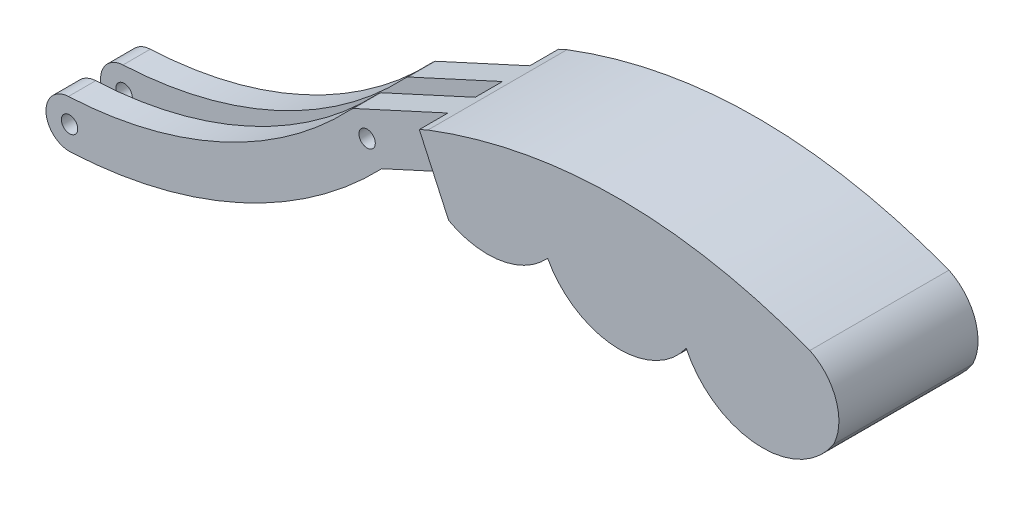
ISO-10303-21;
HEADER;
FILE_DESCRIPTION(('STEP AP214'),'2;1');
FILE_NAME('part.step','',(''),(''),'','','');
FILE_SCHEMA(('AUTOMOTIVE_DESIGN { 1 0 10303 214 1 1 1 1 }'));
ENDSEC;
DATA;
#1=APPLICATION_CONTEXT('core data for automotive mechanical design processes');
#2=APPLICATION_PROTOCOL_DEFINITION('international standard','automotive_design',2000,#1);
#3=PRODUCT_CONTEXT('',#1,'mechanical');
#4=PRODUCT('Part','Part','',(#3));
#5=PRODUCT_RELATED_PRODUCT_CATEGORY('part','',(#4));
#6=PRODUCT_DEFINITION_FORMATION('','',#4);
#7=PRODUCT_DEFINITION_CONTEXT('part definition',#1,'design');
#8=PRODUCT_DEFINITION('design','',#6,#7);
#9=PRODUCT_DEFINITION_SHAPE('','',#8);
#10=(LENGTH_UNIT() NAMED_UNIT(*) SI_UNIT(.MILLI.,.METRE.));
#11=(NAMED_UNIT(*) PLANE_ANGLE_UNIT() SI_UNIT($,.RADIAN.));
#12=(NAMED_UNIT(*) SI_UNIT($,.STERADIAN.) SOLID_ANGLE_UNIT());
#13=UNCERTAINTY_MEASURE_WITH_UNIT(LENGTH_MEASURE(1.E-05),#10,'distance_accuracy_value','');
#14=(GEOMETRIC_REPRESENTATION_CONTEXT(3) GLOBAL_UNCERTAINTY_ASSIGNED_CONTEXT((#13)) GLOBAL_UNIT_ASSIGNED_CONTEXT((#10,
#11,#12)) REPRESENTATION_CONTEXT('',''));
#15=CARTESIAN_POINT('',(0.,0.,0.));
#16=DIRECTION('',(0.,0.,1.));
#17=DIRECTION('',(1.,0.,0.));
#18=AXIS2_PLACEMENT_3D('',#15,#16,#17);
#19=CARTESIAN_POINT('',(-7.51488259564981,160.395538162248,51.));
#20=DIRECTION('',(0.,0.,-1.));
#21=DIRECTION('',(-1.00000000000001,0.,0.));
#22=AXIS2_PLACEMENT_3D('',#19,#20,#21);
#23=CYLINDRICAL_SURFACE('',#22,151.929423701967);
#24=CARTESIAN_POINT('',(-7.51488259564981,160.395538162248,30.5));
#25=DIRECTION('',(0.,0.,1.));
#26=DIRECTION('',(1.00000000000001,0.,0.));
#27=AXIS2_PLACEMENT_3D('',#24,#25,#26);
#28=CIRCLE('',#27,151.929423701967);
#29=CARTESIAN_POINT('',(-0.404455892615174,8.63259268966887,30.5));
#30=VERTEX_POINT('',#29);
#31=CARTESIAN_POINT('',(102.811525100252,55.9415600123962,30.5));
#32=VERTEX_POINT('',#31);
#33=EDGE_CURVE('E337',#30,#32,#28,.T.);
#34=ORIENTED_EDGE('',*,*,#33,.F.);
#35=DIRECTION('',(0.,0.,-1.));
#36=VECTOR('',#35,1.);
#37=CARTESIAN_POINT('',(-0.404455892615174,8.63259268966887,51.));
#38=LINE('',#37,#36);
#39=CARTESIAN_POINT('',(-0.404455892615174,8.63259268966887,40.5));
#40=VERTEX_POINT('',#39);
#41=EDGE_CURVE('E340',#40,#30,#38,.T.);
#42=ORIENTED_EDGE('',*,*,#41,.F.);
#43=CARTESIAN_POINT('',(-7.51488259564981,160.395538162248,40.5));
#44=DIRECTION('',(0.,0.,-1.));
#45=DIRECTION('',(-1.00000000000001,0.,0.));
#46=AXIS2_PLACEMENT_3D('',#43,#44,#45);
#47=CIRCLE('',#46,151.929423701967);
#48=CARTESIAN_POINT('',(102.811525100252,55.9415600123962,40.5));
#49=VERTEX_POINT('',#48);
#50=EDGE_CURVE('E249',#49,#40,#47,.T.);
#51=ORIENTED_EDGE('',*,*,#50,.F.);
#52=DIRECTION('',(0.,0.,-1.));
#53=VECTOR('',#52,1.);
#54=CARTESIAN_POINT('',(102.811525100252,55.9415600123962,51.));
#55=LINE('',#54,#53);
#56=EDGE_CURVE('E342',#49,#32,#55,.T.);
#57=ORIENTED_EDGE('',*,*,#56,.T.);
#58=EDGE_LOOP('',(#34,#42,#51,#57));
#59=FACE_BOUND('',#58,.T.);
#60=ADVANCED_FACE('F47',(#59),#23,.F.);
#61=CARTESIAN_POINT('',(0.,0.,51.));
#62=DIRECTION('',(0.,0.,-1.));
#63=DIRECTION('',(-1.00000000000001,0.,0.));
#64=AXIS2_PLACEMENT_3D('',#61,#62,#63);
#65=CYLINDRICAL_SURFACE('',#64,8.64206231838189);
#66=ORIENTED_EDGE('',*,*,#41,.T.);
#67=CARTESIAN_POINT('',(0.,0.,30.5));
#68=DIRECTION('',(0.,0.,1.));
#69=DIRECTION('',(1.00000000000001,0.,0.));
#70=AXIS2_PLACEMENT_3D('',#67,#68,#69);
#71=CIRCLE('',#70,8.64206231838189);
#72=CARTESIAN_POINT('',(0.404455892615396,-8.63259268966887,30.5));
#73=VERTEX_POINT('',#72);
#74=EDGE_CURVE('E345',#30,#73,#71,.T.);
#75=ORIENTED_EDGE('',*,*,#74,.T.);
#76=DIRECTION('',(0.,0.,-1.));
#77=VECTOR('',#76,1.);
#78=CARTESIAN_POINT('',(0.404455892615396,-8.63259268966887,51.));
#79=LINE('',#78,#77);
#80=CARTESIAN_POINT('',(0.404455892615396,-8.63259268966887,40.5));
#81=VERTEX_POINT('',#80);
#82=EDGE_CURVE('E355',#81,#73,#79,.T.);
#83=ORIENTED_EDGE('',*,*,#82,.F.);
#84=CARTESIAN_POINT('',(0.,0.,40.5));
#85=DIRECTION('',(0.,0.,-1.));
#86=DIRECTION('',(-1.00000000000001,0.,0.));
#87=AXIS2_PLACEMENT_3D('',#84,#85,#86);
#88=CIRCLE('',#87,8.64206231838189);
#89=EDGE_CURVE('E251',#81,#40,#88,.T.);
#90=ORIENTED_EDGE('',*,*,#89,.T.);
#91=EDGE_LOOP('',(#66,#75,#83,#90));
#92=FACE_BOUND('',#91,.T.);
#93=ADVANCED_FACE('F321',(#92),#65,.T.);
#94=CARTESIAN_POINT('',(-7.51488259564981,160.395538162248,51.));
#95=DIRECTION('',(0.,0.,-1.));
#96=DIRECTION('',(-1.00000000000001,0.,0.));
#97=AXIS2_PLACEMENT_3D('',#94,#95,#96);
#98=CYLINDRICAL_SURFACE('',#97,169.213548338731);
#99=ORIENTED_EDGE('',*,*,#82,.T.);
#100=CARTESIAN_POINT('',(-7.51488259564981,160.395538162248,30.5));
#101=DIRECTION('',(0.,0.,1.));
#102=DIRECTION('',(1.00000000000001,0.,0.));
#103=AXIS2_PLACEMENT_3D('',#100,#101,#102);
#104=CIRCLE('',#103,169.213548338731);
#105=CARTESIAN_POINT('',(114.459542910341,43.1118459289813,30.5));
#106=VERTEX_POINT('',#105);
#107=EDGE_CURVE('E478',#73,#106,#104,.T.);
#108=ORIENTED_EDGE('',*,*,#107,.T.);
#109=DIRECTION('',(0.,0.,-1.));
#110=VECTOR('',#109,1.);
#111=CARTESIAN_POINT('',(114.459542910341,43.1118459289813,51.));
#112=LINE('',#111,#110);
#113=CARTESIAN_POINT('',(114.459542910341,43.1118459289813,40.5));
#114=VERTEX_POINT('',#113);
#115=EDGE_CURVE('E402',#114,#106,#112,.T.);
#116=ORIENTED_EDGE('',*,*,#115,.F.);
#117=CARTESIAN_POINT('',(-7.51488259564981,160.395538162248,40.5));
#118=DIRECTION('',(0.,0.,-1.));
#119=DIRECTION('',(-1.00000000000001,0.,0.));
#120=AXIS2_PLACEMENT_3D('',#117,#118,#119);
#121=CIRCLE('',#120,169.213548338731);
#122=EDGE_CURVE('E254',#114,#81,#121,.T.);
#123=ORIENTED_EDGE('',*,*,#122,.T.);
#124=EDGE_LOOP('',(#99,#108,#116,#123));
#125=FACE_BOUND('',#124,.T.);
#126=ADVANCED_FACE('F318',(#125),#98,.T.);
#127=CARTESIAN_POINT('',(3.54177078409457,-7.72723157194288,51.));
#128=DIRECTION('',(-0.416666666666668,0.909059342886315,0.));
#129=DIRECTION('',(-0.909059342886315,-0.416666666666668,0.));
#130=AXIS2_PLACEMENT_3D('',#127,#128,#129);
#131=PLANE('',#130);
#132=ORIENTED_EDGE('',*,*,#115,.T.);
#133=DIRECTION('',(0.909059342886315,0.416666666666668,0.));
#134=VECTOR('',#133,1.);
#135=CARTESIAN_POINT('',(3.54177078409457,-7.72723157194288,30.5));
#136=LINE('',#135,#134);
#137=CARTESIAN_POINT('',(141.660745716674,55.579496793943,30.5));
#138=VERTEX_POINT('',#137);
#139=EDGE_CURVE('E383',#106,#138,#136,.T.);
#140=ORIENTED_EDGE('',*,*,#139,.T.);
#141=DIRECTION('',(0.,0.,-1.));
#142=VECTOR('',#141,1.);
#143=CARTESIAN_POINT('',(141.660745716674,55.579496793943,51.));
#144=LINE('',#143,#142);
#145=CARTESIAN_POINT('',(141.660745716674,55.579496793943,40.5));
#146=VERTEX_POINT('',#145);
#147=EDGE_CURVE('E403',#146,#138,#144,.T.);
#148=ORIENTED_EDGE('',*,*,#147,.F.);
#149=DIRECTION('',(-0.909059342886315,-0.416666666666668,0.));
#150=VECTOR('',#149,1.);
#151=CARTESIAN_POINT('',(3.54177078409457,-7.72723157194288,40.5));
#152=LINE('',#151,#150);
#153=EDGE_CURVE('E257',#146,#114,#152,.T.);
#154=ORIENTED_EDGE('',*,*,#153,.T.);
#155=EDGE_LOOP('',(#132,#140,#148,#154));
#156=FACE_BOUND('',#155,.T.);
#157=ADVANCED_FACE('F314',(#156),#131,.F.);
#158=CARTESIAN_POINT('',(0.,0.,51.));
#159=DIRECTION('',(0.,0.,-1.));
#160=DIRECTION('',(-1.00000000000001,0.,0.));
#161=AXIS2_PLACEMENT_3D('',#158,#159,#160);
#162=CYLINDRICAL_SURFACE('',#161,3.00000000000001);
#163=CARTESIAN_POINT('',(0.,0.,30.5));
#164=DIRECTION('',(0.,0.,1.));
#165=DIRECTION('',(1.00000000000001,0.,0.));
#166=AXIS2_PLACEMENT_3D('',#163,#164,#165);
#167=CIRCLE('',#166,3.00000000000001);
#168=CARTESIAN_POINT('',(3.00000000000002,0.,30.5));
#169=VERTEX_POINT('',#168);
#170=EDGE_CURVE('E372',#169,#169,#167,.T.);
#171=ORIENTED_EDGE('',*,*,#170,.F.);
#172=EDGE_LOOP('',(#171));
#173=FACE_BOUND('',#172,.T.);
#174=CARTESIAN_POINT('',(0.,0.,40.5));
#175=DIRECTION('',(0.,0.,-1.));
#176=DIRECTION('',(-1.00000000000001,0.,0.));
#177=AXIS2_PLACEMENT_3D('',#174,#175,#176);
#178=CIRCLE('',#177,3.00000000000001);
#179=CARTESIAN_POINT('',(-3.00000000000002,0.,40.5));
#180=VERTEX_POINT('',#179);
#181=EDGE_CURVE('E263',#180,#180,#178,.T.);
#182=ORIENTED_EDGE('',*,*,#181,.F.);
#183=EDGE_LOOP('',(#182));
#184=FACE_BOUND('',#183,.T.);
#185=ADVANCED_FACE('F516',(#173,#184),#162,.F.);
#186=CARTESIAN_POINT('',(109.087121146358,50.000000000001,51.));
#187=DIRECTION('',(0.,0.,-1.));
#188=DIRECTION('',(-1.00000000000001,0.,0.));
#189=AXIS2_PLACEMENT_3D('',#186,#187,#188);
#190=CYLINDRICAL_SURFACE('',#189,8.64206231838191);
#191=DIRECTION('',(0.,0.,-1.));
#192=VECTOR('',#191,1.);
#193=CARTESIAN_POINT('',(104.127977562039,57.0775798140967,51.));
#194=LINE('',#193,#192);
#195=CARTESIAN_POINT('',(104.127977562039,57.0775798140967,40.5));
#196=VERTEX_POINT('',#195);
#197=CARTESIAN_POINT('',(104.127977562039,57.0775798140967,30.5));
#198=VERTEX_POINT('',#197);
#199=EDGE_CURVE('E422',#196,#198,#194,.T.);
#200=ORIENTED_EDGE('',*,*,#199,.T.);
#201=CARTESIAN_POINT('',(109.087121146358,50.000000000001,30.5));
#202=DIRECTION('',(0.,0.,1.));
#203=DIRECTION('',(1.00000000000001,0.,0.));
#204=AXIS2_PLACEMENT_3D('',#201,#202,#203);
#205=CIRCLE('',#204,8.64206231838191);
#206=EDGE_CURVE('E367',#198,#32,#205,.T.);
#207=ORIENTED_EDGE('',*,*,#206,.T.);
#208=ORIENTED_EDGE('',*,*,#56,.F.);
#209=CARTESIAN_POINT('',(109.087121146358,50.000000000001,40.5));
#210=DIRECTION('',(0.,0.,-1.));
#211=DIRECTION('',(-1.00000000000001,0.,0.));
#212=AXIS2_PLACEMENT_3D('',#209,#210,#211);
#213=CIRCLE('',#212,8.64206231838191);
#214=EDGE_CURVE('E244',#49,#196,#213,.T.);
#215=ORIENTED_EDGE('',*,*,#214,.T.);
#216=EDGE_LOOP('',(#200,#207,#208,#215));
#217=FACE_BOUND('',#216,.T.);
#218=ADVANCED_FACE('F474',(#217),#190,.T.);
#219=CARTESIAN_POINT('',(109.087121146358,50.0000000000012,51.));
#220=DIRECTION('',(0.,0.,-1.));
#221=DIRECTION('',(-1.00000000000001,0.,0.));
#222=AXIS2_PLACEMENT_3D('',#219,#220,#221);
#223=CYLINDRICAL_SURFACE('',#222,3.00000000000001);
#224=CARTESIAN_POINT('',(109.087121146358,50.0000000000012,30.5));
#225=DIRECTION('',(0.,0.,1.));
#226=DIRECTION('',(1.00000000000001,0.,0.));
#227=AXIS2_PLACEMENT_3D('',#224,#225,#226);
#228=CIRCLE('',#227,3.00000000000001);
#229=CARTESIAN_POINT('',(112.087121146358,50.0000000000012,30.5));
#230=VERTEX_POINT('',#229);
#231=EDGE_CURVE('E365',#230,#230,#228,.T.);
#232=ORIENTED_EDGE('',*,*,#231,.F.);
#233=EDGE_LOOP('',(#232));
#234=FACE_BOUND('',#233,.T.);
#235=CARTESIAN_POINT('',(109.087121146358,50.0000000000012,40.5));
#236=DIRECTION('',(0.,0.,-1.));
#237=DIRECTION('',(-1.00000000000001,0.,0.));
#238=AXIS2_PLACEMENT_3D('',#235,#236,#237);
#239=CIRCLE('',#238,3.00000000000001);
#240=CARTESIAN_POINT('',(106.087121146358,50.0000000000012,40.5));
#241=VERTEX_POINT('',#240);
#242=EDGE_CURVE('E243',#241,#241,#239,.T.);
#243=ORIENTED_EDGE('',*,*,#242,.F.);
#244=EDGE_LOOP('',(#243));
#245=FACE_BOUND('',#244,.T.);
#246=ADVANCED_FACE('F325',(#234,#245),#223,.F.);
#247=CARTESIAN_POINT('',(-7.51488259564981,160.395538162248,10.5));
#248=DIRECTION('',(0.,0.,1.));
#249=DIRECTION('',(1.00000000000001,0.,0.));
#250=AXIS2_PLACEMENT_3D('',#247,#248,#249);
#251=CIRCLE('',#250,151.929423701967);
#252=CARTESIAN_POINT('',(-0.404455892615174,8.63259268966887,10.5));
#253=VERTEX_POINT('',#252);
#254=CARTESIAN_POINT('',(102.811525100252,55.9415600123962,10.5));
#255=VERTEX_POINT('',#254);
#256=EDGE_CURVE('E388',#253,#255,#251,.T.);
#257=ORIENTED_EDGE('',*,*,#256,.F.);
#258=CARTESIAN_POINT('',(-0.404455892615174,8.63259268966887,20.5));
#259=VERTEX_POINT('',#258);
#260=EDGE_CURVE('E352',#259,#253,#38,.T.);
#261=ORIENTED_EDGE('',*,*,#260,.F.);
#262=CARTESIAN_POINT('',(-7.51488259564981,160.395538162248,20.5));
#263=DIRECTION('',(0.,0.,-1.));
#264=DIRECTION('',(-1.00000000000001,0.,0.));
#265=AXIS2_PLACEMENT_3D('',#262,#263,#264);
#266=CIRCLE('',#265,151.929423701967);
#267=CARTESIAN_POINT('',(102.811525100252,55.9415600123962,20.5));
#268=VERTEX_POINT('',#267);
#269=EDGE_CURVE('E492',#268,#259,#266,.T.);
#270=ORIENTED_EDGE('',*,*,#269,.F.);
#271=EDGE_CURVE('E427',#268,#255,#55,.T.);
#272=ORIENTED_EDGE('',*,*,#271,.T.);
#273=EDGE_LOOP('',(#257,#261,#270,#272));
#274=FACE_BOUND('',#273,.T.);
#275=ADVANCED_FACE('F49',(#274),#23,.F.);
#276=ORIENTED_EDGE('',*,*,#260,.T.);
#277=CARTESIAN_POINT('',(0.,0.,10.5));
#278=DIRECTION('',(0.,0.,1.));
#279=DIRECTION('',(1.00000000000001,0.,0.));
#280=AXIS2_PLACEMENT_3D('',#277,#278,#279);
#281=CIRCLE('',#280,8.64206231838189);
#282=CARTESIAN_POINT('',(0.404455892615396,-8.63259268966887,10.5));
#283=VERTEX_POINT('',#282);
#284=EDGE_CURVE('E390',#253,#283,#281,.T.);
#285=ORIENTED_EDGE('',*,*,#284,.T.);
#286=CARTESIAN_POINT('',(0.404455892615396,-8.63259268966887,20.5));
#287=VERTEX_POINT('',#286);
#288=EDGE_CURVE('E399',#287,#283,#79,.T.);
#289=ORIENTED_EDGE('',*,*,#288,.F.);
#290=CARTESIAN_POINT('',(0.,0.,20.5));
#291=DIRECTION('',(0.,0.,-1.));
#292=DIRECTION('',(-1.00000000000001,0.,0.));
#293=AXIS2_PLACEMENT_3D('',#290,#291,#292);
#294=CIRCLE('',#293,8.64206231838189);
#295=EDGE_CURVE('E494',#287,#259,#294,.T.);
#296=ORIENTED_EDGE('',*,*,#295,.T.);
#297=EDGE_LOOP('',(#276,#285,#289,#296));
#298=FACE_BOUND('',#297,.T.);
#299=ADVANCED_FACE('F316',(#298),#65,.T.);
#300=ORIENTED_EDGE('',*,*,#288,.T.);
#301=CARTESIAN_POINT('',(-7.51488259564981,160.395538162248,10.5));
#302=DIRECTION('',(0.,0.,1.));
#303=DIRECTION('',(1.00000000000001,0.,0.));
#304=AXIS2_PLACEMENT_3D('',#301,#302,#303);
#305=CIRCLE('',#304,169.213548338731);
#306=CARTESIAN_POINT('',(114.459542910341,43.1118459289813,10.5));
#307=VERTEX_POINT('',#306);
#308=EDGE_CURVE('E229',#283,#307,#305,.T.);
#309=ORIENTED_EDGE('',*,*,#308,.T.);
#310=CARTESIAN_POINT('',(114.459542910341,43.1118459289813,20.5));
#311=VERTEX_POINT('',#310);
#312=EDGE_CURVE('E397',#311,#307,#112,.T.);
#313=ORIENTED_EDGE('',*,*,#312,.F.);
#314=CARTESIAN_POINT('',(-7.51488259564981,160.395538162248,20.5));
#315=DIRECTION('',(0.,0.,-1.));
#316=DIRECTION('',(-1.00000000000001,0.,0.));
#317=AXIS2_PLACEMENT_3D('',#314,#315,#316);
#318=CIRCLE('',#317,169.213548338731);
#319=EDGE_CURVE('E497',#311,#287,#318,.T.);
#320=ORIENTED_EDGE('',*,*,#319,.T.);
#321=EDGE_LOOP('',(#300,#309,#313,#320));
#322=FACE_BOUND('',#321,.T.);
#323=ADVANCED_FACE('F312',(#322),#98,.T.);
#324=ORIENTED_EDGE('',*,*,#312,.T.);
#325=DIRECTION('',(0.909059342886315,0.416666666666668,0.));
#326=VECTOR('',#325,1.);
#327=CARTESIAN_POINT('',(3.54177078409457,-7.72723157194288,10.5));
#328=LINE('',#327,#326);
#329=CARTESIAN_POINT('',(141.660745716674,55.579496793943,10.5));
#330=VERTEX_POINT('',#329);
#331=EDGE_CURVE('E224',#307,#330,#328,.T.);
#332=ORIENTED_EDGE('',*,*,#331,.T.);
#333=CARTESIAN_POINT('',(141.660745716674,55.579496793943,20.5));
#334=VERTEX_POINT('',#333);
#335=EDGE_CURVE('E222',#334,#330,#144,.T.);
#336=ORIENTED_EDGE('',*,*,#335,.F.);
#337=DIRECTION('',(-0.909059342886315,-0.416666666666668,0.));
#338=VECTOR('',#337,1.);
#339=CARTESIAN_POINT('',(3.54177078409457,-7.72723157194288,20.5));
#340=LINE('',#339,#338);
#341=EDGE_CURVE('E401',#334,#311,#340,.T.);
#342=ORIENTED_EDGE('',*,*,#341,.T.);
#343=EDGE_LOOP('',(#324,#332,#336,#342));
#344=FACE_BOUND('',#343,.T.);
#345=ADVANCED_FACE('F309',(#344),#131,.F.);
#346=CARTESIAN_POINT('',(163.715018222086,75.6745486769844,51.));
#347=DIRECTION('',(0.,0.,-1.));
#348=DIRECTION('',(-1.00000000000001,0.,0.));
#349=AXIS2_PLACEMENT_3D('',#346,#347,#348);
#350=CYLINDRICAL_SURFACE('',#349,29.8362538855851);
#351=CARTESIAN_POINT('',(163.715018222086,75.6745486769844,10.5));
#352=DIRECTION('',(0.,0.,1.));
#353=DIRECTION('',(1.00000000000001,0.,0.));
#354=AXIS2_PLACEMENT_3D('',#351,#352,#353);
#355=CIRCLE('',#354,29.8362538855851);
#356=CARTESIAN_POINT('',(149.4918839759,49.4466151300944,10.5));
#357=VERTEX_POINT('',#356);
#358=EDGE_CURVE('E212',#330,#357,#355,.T.);
#359=ORIENTED_EDGE('',*,*,#358,.T.);
#360=DIRECTION('',(0.,0.,-1.));
#361=VECTOR('',#360,1.);
#362=CARTESIAN_POINT('',(149.4918839759,49.4466151300944,51.));
#363=LINE('',#362,#361);
#364=CARTESIAN_POINT('',(149.4918839759,49.4466151300944,0.));
#365=VERTEX_POINT('',#364);
#366=EDGE_CURVE('E201',#357,#365,#363,.T.);
#367=ORIENTED_EDGE('',*,*,#366,.T.);
#368=CARTESIAN_POINT('',(163.715018222086,75.6745486769844,0.));
#369=DIRECTION('',(0.,0.,1.));
#370=DIRECTION('',(1.00000000000001,0.,0.));
#371=AXIS2_PLACEMENT_3D('',#368,#369,#370);
#372=CIRCLE('',#371,29.8362538855851);
#373=CARTESIAN_POINT('',(185.769290727498,55.5794967939431,0.));
#374=VERTEX_POINT('',#373);
#375=EDGE_CURVE('E266',#365,#374,#372,.T.);
#376=ORIENTED_EDGE('',*,*,#375,.T.);
#377=DIRECTION('',(0.,0.,-1.));
#378=VECTOR('',#377,1.);
#379=CARTESIAN_POINT('',(185.769290727498,55.5794967939431,51.));
#380=LINE('',#379,#378);
#381=CARTESIAN_POINT('',(185.769290727498,55.5794967939431,51.));
#382=VERTEX_POINT('',#381);
#383=EDGE_CURVE('E408',#382,#374,#380,.T.);
#384=ORIENTED_EDGE('',*,*,#383,.F.);
#385=CARTESIAN_POINT('',(163.715018222086,75.6745486769844,51.));
#386=DIRECTION('',(0.,0.,1.));
#387=DIRECTION('',(1.00000000000001,0.,0.));
#388=AXIS2_PLACEMENT_3D('',#385,#386,#387);
#389=CIRCLE('',#388,29.8362538855851);
#390=CARTESIAN_POINT('',(149.4918839759,49.4466151300944,51.));
#391=VERTEX_POINT('',#390);
#392=EDGE_CURVE('E267',#391,#382,#389,.T.);
#393=ORIENTED_EDGE('',*,*,#392,.F.);
#394=DIRECTION('',(0.,0.,-1.));
#395=VECTOR('',#394,1.);
#396=CARTESIAN_POINT('',(149.4918839759,49.4466151300944,51.));
#397=LINE('',#396,#395);
#398=CARTESIAN_POINT('',(149.4918839759,49.4466151300944,40.5));
#399=VERTEX_POINT('',#398);
#400=EDGE_CURVE('E240',#391,#399,#397,.T.);
#401=ORIENTED_EDGE('',*,*,#400,.T.);
#402=CARTESIAN_POINT('',(163.715018222086,75.6745486769844,40.5));
#403=DIRECTION('',(0.,0.,-1.));
#404=DIRECTION('',(-1.00000000000001,0.,0.));
#405=AXIS2_PLACEMENT_3D('',#402,#403,#404);
#406=CIRCLE('',#405,29.8362538855851);
#407=EDGE_CURVE('E260',#399,#146,#406,.T.);
#408=ORIENTED_EDGE('',*,*,#407,.T.);
#409=ORIENTED_EDGE('',*,*,#147,.T.);
#410=CARTESIAN_POINT('',(163.715018222086,75.6745486769844,30.5));
#411=DIRECTION('',(0.,0.,1.));
#412=DIRECTION('',(1.00000000000001,0.,0.));
#413=AXIS2_PLACEMENT_3D('',#410,#411,#412);
#414=CIRCLE('',#413,29.8362538855851);
#415=CARTESIAN_POINT('',(149.4918839759,49.4466151300944,30.5));
#416=VERTEX_POINT('',#415);
#417=EDGE_CURVE('E378',#138,#416,#414,.T.);
#418=ORIENTED_EDGE('',*,*,#417,.T.);
#419=DIRECTION('',(0.,0.,-1.));
#420=VECTOR('',#419,1.);
#421=CARTESIAN_POINT('',(149.4918839759,49.4466151300944,51.));
#422=LINE('',#421,#420);
#423=CARTESIAN_POINT('',(149.4918839759,49.4466151300944,20.5));
#424=VERTEX_POINT('',#423);
#425=EDGE_CURVE('E227',#416,#424,#422,.T.);
#426=ORIENTED_EDGE('',*,*,#425,.T.);
#427=CARTESIAN_POINT('',(163.715018222086,75.6745486769844,20.5));
#428=DIRECTION('',(0.,0.,-1.));
#429=DIRECTION('',(-1.00000000000001,0.,0.));
#430=AXIS2_PLACEMENT_3D('',#427,#428,#429);
#431=CIRCLE('',#430,29.8362538855851);
#432=EDGE_CURVE('E500',#424,#334,#431,.T.);
#433=ORIENTED_EDGE('',*,*,#432,.T.);
#434=ORIENTED_EDGE('',*,*,#335,.T.);
#435=EDGE_LOOP('',(#359,#367,#376,#384,#393,#401,#408,#409,#418,#426,#433,#434));
#436=FACE_BOUND('',#435,.T.);
#437=ADVANCED_FACE('F219',(#436),#350,.T.);
#438=CARTESIAN_POINT('',(212.155670816658,69.8157215091378,51.));
#439=DIRECTION('',(0.,0.,-1.));
#440=DIRECTION('',(-1.00000000000001,0.,0.));
#441=AXIS2_PLACEMENT_3D('',#438,#439,#440);
#442=CYLINDRICAL_SURFACE('',#441,29.9818469803163);
#443=CARTESIAN_POINT('',(212.155670816658,69.8157215091378,0.));
#444=DIRECTION('',(0.,0.,1.));
#445=DIRECTION('',(1.00000000000001,0.,0.));
#446=AXIS2_PLACEMENT_3D('',#443,#444,#445);
#447=CIRCLE('',#446,29.9818469803163);
#448=CARTESIAN_POINT('',(236.56917477982,52.4119296064587,0.));
#449=VERTEX_POINT('',#448);
#450=EDGE_CURVE('E442',#374,#449,#447,.T.);
#451=ORIENTED_EDGE('',*,*,#450,.T.);
#452=DIRECTION('',(0.,0.,-1.));
#453=VECTOR('',#452,1.);
#454=CARTESIAN_POINT('',(236.56917477982,52.4119296064587,51.));
#455=LINE('',#454,#453);
#456=CARTESIAN_POINT('',(236.56917477982,52.4119296064587,51.));
#457=VERTEX_POINT('',#456);
#458=EDGE_CURVE('E411',#457,#449,#455,.T.);
#459=ORIENTED_EDGE('',*,*,#458,.F.);
#460=CARTESIAN_POINT('',(212.155670816658,69.8157215091378,51.));
#461=DIRECTION('',(0.,0.,1.));
#462=DIRECTION('',(1.00000000000001,0.,0.));
#463=AXIS2_PLACEMENT_3D('',#460,#461,#462);
#464=CIRCLE('',#463,29.9818469803163);
#465=EDGE_CURVE('E269',#382,#457,#464,.T.);
#466=ORIENTED_EDGE('',*,*,#465,.F.);
#467=ORIENTED_EDGE('',*,*,#383,.T.);
#468=EDGE_LOOP('',(#451,#459,#466,#467));
#469=FACE_BOUND('',#468,.T.);
#470=ADVANCED_FACE('F302',(#469),#442,.T.);
#471=CARTESIAN_POINT('',(264.561483982289,65.8243253508149,51.));
#472=DIRECTION('',(0.,0.,-1.));
#473=DIRECTION('',(-1.00000000000001,0.,0.));
#474=AXIS2_PLACEMENT_3D('',#471,#472,#473);
#475=CYLINDRICAL_SURFACE('',#474,31.039679993354);
#476=CARTESIAN_POINT('',(264.561483982289,65.8243253508149,0.));
#477=DIRECTION('',(0.,0.,1.));
#478=DIRECTION('',(1.00000000000001,0.,0.));
#479=AXIS2_PLACEMENT_3D('',#476,#477,#478);
#480=CIRCLE('',#479,31.039679993354);
#481=CARTESIAN_POINT('',(290.598242924559,48.9261326110003,0.));
#482=VERTEX_POINT('',#481);
#483=EDGE_CURVE('E440',#449,#482,#480,.T.);
#484=ORIENTED_EDGE('',*,*,#483,.T.);
#485=DIRECTION('',(0.,0.,-1.));
#486=VECTOR('',#485,1.);
#487=CARTESIAN_POINT('',(290.598242924559,48.9261326110003,51.));
#488=LINE('',#487,#486);
#489=CARTESIAN_POINT('',(290.598242924559,48.9261326110003,51.));
#490=VERTEX_POINT('',#489);
#491=EDGE_CURVE('E414',#490,#482,#488,.T.);
#492=ORIENTED_EDGE('',*,*,#491,.F.);
#493=CARTESIAN_POINT('',(264.561483982289,65.8243253508149,51.));
#494=DIRECTION('',(0.,0.,1.));
#495=DIRECTION('',(1.00000000000001,0.,0.));
#496=AXIS2_PLACEMENT_3D('',#493,#494,#495);
#497=CIRCLE('',#496,31.039679993354);
#498=EDGE_CURVE('E272',#457,#490,#497,.T.);
#499=ORIENTED_EDGE('',*,*,#498,.F.);
#500=ORIENTED_EDGE('',*,*,#458,.T.);
#501=EDGE_LOOP('',(#484,#492,#499,#500));
#502=FACE_BOUND('',#501,.T.);
#503=ADVANCED_FACE('F298',(#502),#475,.T.);
#504=CARTESIAN_POINT('',(273.519100687333,57.3147560013845,51.));
#505=DIRECTION('',(0.,0.,-1.));
#506=DIRECTION('',(-1.00000000000001,0.,0.));
#507=AXIS2_PLACEMENT_3D('',#504,#505,#506);
#508=CYLINDRICAL_SURFACE('',#507,19.0280346316984);
#509=CARTESIAN_POINT('',(273.519100687333,57.3147560013845,0.));
#510=DIRECTION('',(0.,0.,1.));
#511=DIRECTION('',(1.00000000000001,0.,0.));
#512=AXIS2_PLACEMENT_3D('',#509,#510,#511);
#513=CIRCLE('',#512,19.0280346316984);
#514=CARTESIAN_POINT('',(281.907724077717,74.3938982386106,0.));
#515=VERTEX_POINT('',#514);
#516=EDGE_CURVE('E434',#482,#515,#513,.T.);
#517=ORIENTED_EDGE('',*,*,#516,.T.);
#518=DIRECTION('',(0.,0.,-1.));
#519=VECTOR('',#518,1.);
#520=CARTESIAN_POINT('',(281.907724077717,74.3938982386106,51.));
#521=LINE('',#520,#519);
#522=CARTESIAN_POINT('',(281.907724077717,74.3938982386106,51.));
#523=VERTEX_POINT('',#522);
#524=EDGE_CURVE('E417',#523,#515,#521,.T.);
#525=ORIENTED_EDGE('',*,*,#524,.F.);
#526=CARTESIAN_POINT('',(273.519100687333,57.3147560013845,51.));
#527=DIRECTION('',(0.,0.,1.));
#528=DIRECTION('',(1.00000000000001,0.,0.));
#529=AXIS2_PLACEMENT_3D('',#526,#527,#528);
#530=CIRCLE('',#529,19.0280346316984);
#531=EDGE_CURVE('E274',#490,#523,#530,.T.);
#532=ORIENTED_EDGE('',*,*,#531,.F.);
#533=ORIENTED_EDGE('',*,*,#491,.T.);
#534=EDGE_LOOP('',(#517,#525,#532,#533));
#535=FACE_BOUND('',#534,.T.);
#536=ADVANCED_FACE('F293',(#535),#508,.T.);
#537=CARTESIAN_POINT('',(141.907724077716,74.3938982386109,51.));
#538=CARTESIAN_POINT('',(211.705167046839,100.839206128301,51.));
#539=CARTESIAN_POINT('',(281.907724077717,74.3938982386106,51.));
#540=B_SPLINE_CURVE_WITH_KNOTS('',2,(#537,#538,#539),.UNSPECIFIED.,.F.,.F.,(3,3),(0.,1.),.UNSPECIFIED.);
#541=DIRECTION('',(0.,0.,-1.));
#542=VECTOR('',#541,1.);
#543=SURFACE_OF_LINEAR_EXTRUSION('',#540,#542);
#544=CARTESIAN_POINT('',(141.907724077716,74.3938982386109,0.));
#545=CARTESIAN_POINT('',(211.705167046839,100.839206128301,0.));
#546=CARTESIAN_POINT('',(281.907724077717,74.3938982386106,0.));
#547=B_SPLINE_CURVE_WITH_KNOTS('',2,(#544,#545,#546),.UNSPECIFIED.,.F.,.F.,(3,3),(0.,1.),.UNSPECIFIED.);
#548=CARTESIAN_POINT('',(141.907724077715,74.393898238611,0.));
#549=VERTEX_POINT('',#548);
#550=EDGE_CURVE('E429',#549,#515,#547,.T.);
#551=ORIENTED_EDGE('',*,*,#550,.F.);
#552=DIRECTION('',(0.,0.,-1.));
#553=VECTOR('',#552,1.);
#554=CARTESIAN_POINT('',(141.907724077715,74.393898238611,51.));
#555=LINE('',#554,#553);
#556=CARTESIAN_POINT('',(141.907724077715,74.393898238611,51.));
#557=VERTEX_POINT('',#556);
#558=EDGE_CURVE('E419',#557,#549,#555,.T.);
#559=ORIENTED_EDGE('',*,*,#558,.F.);
#560=EDGE_CURVE('E276',#557,#523,#540,.T.);
#561=ORIENTED_EDGE('',*,*,#560,.T.);
#562=ORIENTED_EDGE('',*,*,#524,.T.);
#563=EDGE_LOOP('',(#551,#559,#561,#562));
#564=FACE_BOUND('',#563,.T.);
#565=ADVANCED_FACE('F288',(#564),#543,.T.);
#566=CARTESIAN_POINT('',(-3.54177078409468,7.72723157194333,51.));
#567=DIRECTION('',(-0.416666666666669,0.909059342886314,0.));
#568=DIRECTION('',(-0.909059342886315,-0.416666666666669,0.));
#569=AXIS2_PLACEMENT_3D('',#566,#567,#568);
#570=PLANE('',#569);
#571=DIRECTION('',(0.,0.,-1.));
#572=VECTOR('',#571,1.);
#573=CARTESIAN_POINT('',(138.725789220204,72.9354607878496,51.));
#574=LINE('',#573,#572);
#575=CARTESIAN_POINT('',(138.725789220204,72.9354607878496,10.5));
#576=VERTEX_POINT('',#575);
#577=CARTESIAN_POINT('',(138.725789220204,72.9354607878495,0.));
#578=VERTEX_POINT('',#577);
#579=EDGE_CURVE('E70',#576,#578,#574,.T.);
#580=ORIENTED_EDGE('',*,*,#579,.F.);
#581=DIRECTION('',(0.909059342886315,0.416666666666669,0.));
#582=VECTOR('',#581,1.);
#583=CARTESIAN_POINT('',(-3.54177078409468,7.72723157194333,10.5));
#584=LINE('',#583,#582);
#585=CARTESIAN_POINT('',(104.127977562039,57.0775798140967,10.5));
#586=VERTEX_POINT('',#585);
#587=EDGE_CURVE('E215',#586,#576,#584,.T.);
#588=ORIENTED_EDGE('',*,*,#587,.F.);
#589=CARTESIAN_POINT('',(104.127977562039,57.0775798140967,20.5));
#590=VERTEX_POINT('',#589);
#591=EDGE_CURVE('E425',#590,#586,#194,.T.);
#592=ORIENTED_EDGE('',*,*,#591,.F.);
#593=DIRECTION('',(-0.909059342886315,-0.416666666666669,0.));
#594=VECTOR('',#593,1.);
#595=CARTESIAN_POINT('',(-3.54177078409468,7.72723157194333,20.5));
#596=LINE('',#595,#594);
#597=CARTESIAN_POINT('',(138.725789220204,72.9354607878495,20.5));
#598=VERTEX_POINT('',#597);
#599=EDGE_CURVE('E62',#598,#590,#596,.T.);
#600=ORIENTED_EDGE('',*,*,#599,.F.);
#601=DIRECTION('',(0.,0.,-1.));
#602=VECTOR('',#601,1.);
#603=CARTESIAN_POINT('',(138.725789220204,72.9354607878495,51.));
#604=LINE('',#603,#602);
#605=CARTESIAN_POINT('',(138.725789220204,72.9354607878495,30.5));
#606=VERTEX_POINT('',#605);
#607=EDGE_CURVE('E13',#606,#598,#604,.T.);
#608=ORIENTED_EDGE('',*,*,#607,.F.);
#609=DIRECTION('',(0.909059342886315,0.416666666666669,0.));
#610=VECTOR('',#609,1.);
#611=CARTESIAN_POINT('',(-3.54177078409468,7.72723157194333,30.5));
#612=LINE('',#611,#610);
#613=EDGE_CURVE('E346',#198,#606,#612,.T.);
#614=ORIENTED_EDGE('',*,*,#613,.F.);
#615=ORIENTED_EDGE('',*,*,#199,.F.);
#616=DIRECTION('',(-0.909059342886315,-0.416666666666669,0.));
#617=VECTOR('',#616,1.);
#618=CARTESIAN_POINT('',(-3.54177078409468,7.72723157194333,40.5));
#619=LINE('',#618,#617);
#620=CARTESIAN_POINT('',(138.725789220204,72.9354607878496,40.5));
#621=VERTEX_POINT('',#620);
#622=EDGE_CURVE('E247',#621,#196,#619,.T.);
#623=ORIENTED_EDGE('',*,*,#622,.F.);
#624=DIRECTION('',(0.,0.,-1.));
#625=VECTOR('',#624,1.);
#626=CARTESIAN_POINT('',(138.725789220204,72.9354607878496,51.));
#627=LINE('',#626,#625);
#628=CARTESIAN_POINT('',(138.725789220204,72.9354607878495,51.));
#629=VERTEX_POINT('',#628);
#630=EDGE_CURVE('E238',#629,#621,#627,.T.);
#631=ORIENTED_EDGE('',*,*,#630,.F.);
#632=DIRECTION('',(0.909059342886315,0.416666666666669,0.));
#633=VECTOR('',#632,1.);
#634=CARTESIAN_POINT('',(-3.54177078409468,7.72723157194333,51.));
#635=LINE('',#634,#633);
#636=EDGE_CURVE('E282',#629,#557,#635,.T.);
#637=ORIENTED_EDGE('',*,*,#636,.T.);
#638=ORIENTED_EDGE('',*,*,#558,.T.);
#639=DIRECTION('',(0.909059342886315,0.416666666666669,0.));
#640=VECTOR('',#639,1.);
#641=CARTESIAN_POINT('',(-3.54177078409468,7.72723157194333,0.));
#642=LINE('',#641,#640);
#643=EDGE_CURVE('E270',#578,#549,#642,.T.);
#644=ORIENTED_EDGE('',*,*,#643,.F.);
#645=EDGE_LOOP('',(#580,#588,#592,#600,#608,#614,#615,#623,#631,#637,#638,#644));
#646=FACE_BOUND('',#645,.T.);
#647=ADVANCED_FACE('F292',(#646),#570,.T.);
#648=ORIENTED_EDGE('',*,*,#591,.T.);
#649=CARTESIAN_POINT('',(109.087121146358,50.000000000001,10.5));
#650=DIRECTION('',(0.,0.,1.));
#651=DIRECTION('',(1.00000000000001,0.,0.));
#652=AXIS2_PLACEMENT_3D('',#649,#650,#651);
#653=CIRCLE('',#652,8.64206231838191);
#654=EDGE_CURVE('E371',#586,#255,#653,.T.);
#655=ORIENTED_EDGE('',*,*,#654,.T.);
#656=ORIENTED_EDGE('',*,*,#271,.F.);
#657=CARTESIAN_POINT('',(109.087121146358,50.000000000001,20.5));
#658=DIRECTION('',(0.,0.,-1.));
#659=DIRECTION('',(-1.00000000000001,0.,0.));
#660=AXIS2_PLACEMENT_3D('',#657,#658,#659);
#661=CIRCLE('',#660,8.64206231838191);
#662=EDGE_CURVE('E364',#268,#590,#661,.T.);
#663=ORIENTED_EDGE('',*,*,#662,.T.);
#664=EDGE_LOOP('',(#648,#655,#656,#663));
#665=FACE_BOUND('',#664,.T.);
#666=ADVANCED_FACE('F529',(#665),#190,.T.);
#667=CARTESIAN_POINT('',(0.,0.,51.));
#668=DIRECTION('',(0.,0.,1.));
#669=DIRECTION('',(1.00000000000001,0.,0.));
#670=AXIS2_PLACEMENT_3D('',#667,#668,#669);
#671=PLANE('',#670);
#672=DIRECTION('',(-0.416666666666669,0.909059342886315,0.));
#673=VECTOR('',#672,1.);
#674=CARTESIAN_POINT('',(142.267560004299,65.2082292159062,51.));
#675=LINE('',#674,#673);
#676=EDGE_CURVE('E351',#391,#629,#675,.T.);
#677=ORIENTED_EDGE('',*,*,#676,.F.);
#678=ORIENTED_EDGE('',*,*,#392,.T.);
#679=ORIENTED_EDGE('',*,*,#465,.T.);
#680=ORIENTED_EDGE('',*,*,#498,.T.);
#681=ORIENTED_EDGE('',*,*,#531,.T.);
#682=ORIENTED_EDGE('',*,*,#560,.F.);
#683=ORIENTED_EDGE('',*,*,#636,.F.);
#684=EDGE_LOOP('',(#677,#678,#679,#680,#681,#682,#683));
#685=FACE_BOUND('',#684,.T.);
#686=ADVANCED_FACE('F459',(#685),#671,.T.);
#687=CARTESIAN_POINT('',(0.,0.,0.));
#688=DIRECTION('',(0.,0.,1.));
#689=DIRECTION('',(1.00000000000001,0.,0.));
#690=AXIS2_PLACEMENT_3D('',#687,#688,#689);
#691=PLANE('',#690);
#692=ORIENTED_EDGE('',*,*,#375,.F.);
#693=DIRECTION('',(-0.416666666666669,0.909059342886315,0.));
#694=VECTOR('',#693,1.);
#695=CARTESIAN_POINT('',(142.267560004299,65.2082292159062,0.));
#696=LINE('',#695,#694);
#697=EDGE_CURVE('E55',#365,#578,#696,.T.);
#698=ORIENTED_EDGE('',*,*,#697,.T.);
#699=ORIENTED_EDGE('',*,*,#643,.T.);
#700=ORIENTED_EDGE('',*,*,#550,.T.);
#701=ORIENTED_EDGE('',*,*,#516,.F.);
#702=ORIENTED_EDGE('',*,*,#483,.F.);
#703=ORIENTED_EDGE('',*,*,#450,.F.);
#704=EDGE_LOOP('',(#692,#698,#699,#700,#701,#702,#703));
#705=FACE_BOUND('',#704,.T.);
#706=ADVANCED_FACE('F450',(#705),#691,.F.);
#707=CARTESIAN_POINT('',(196.33038800788,-52.7429361429194,40.5));
#708=DIRECTION('',(0.,0.,-1.));
#709=DIRECTION('',(-1.00000000000001,0.,0.));
#710=AXIS2_PLACEMENT_3D('',#707,#708,#709);
#711=PLANE('',#710);
#712=ORIENTED_EDGE('',*,*,#181,.T.);
#713=EDGE_LOOP('',(#712));
#714=FACE_BOUND('',#713,.T.);
#715=ORIENTED_EDGE('',*,*,#242,.T.);
#716=EDGE_LOOP('',(#715));
#717=FACE_BOUND('',#716,.T.);
#718=DIRECTION('',(-0.416666666666669,0.909059342886315,0.));
#719=VECTOR('',#718,1.);
#720=CARTESIAN_POINT('',(196.33038800788,-52.7429361429194,40.5));
#721=LINE('',#720,#719);
#722=EDGE_CURVE('E235',#399,#621,#721,.T.);
#723=ORIENTED_EDGE('',*,*,#722,.T.);
#724=ORIENTED_EDGE('',*,*,#622,.T.);
#725=ORIENTED_EDGE('',*,*,#214,.F.);
#726=ORIENTED_EDGE('',*,*,#50,.T.);
#727=ORIENTED_EDGE('',*,*,#89,.F.);
#728=ORIENTED_EDGE('',*,*,#122,.F.);
#729=ORIENTED_EDGE('',*,*,#153,.F.);
#730=ORIENTED_EDGE('',*,*,#407,.F.);
#731=EDGE_LOOP('',(#723,#724,#725,#726,#727,#728,#729,#730));
#732=FACE_BOUND('',#731,.T.);
#733=ADVANCED_FACE('F468',(#714,#717,#732),#711,.F.);
#734=CARTESIAN_POINT('',(196.33038800788,-52.7429361429194,40.5));
#735=DIRECTION('',(0.909059342886315,0.416666666666669,0.));
#736=DIRECTION('',(-0.416666666666669,0.909059342886315,0.));
#737=AXIS2_PLACEMENT_3D('',#734,#735,#736);
#738=PLANE('',#737);
#739=ORIENTED_EDGE('',*,*,#676,.T.);
#740=ORIENTED_EDGE('',*,*,#630,.T.);
#741=ORIENTED_EDGE('',*,*,#722,.F.);
#742=ORIENTED_EDGE('',*,*,#400,.F.);
#743=EDGE_LOOP('',(#739,#740,#741,#742));
#744=FACE_BOUND('',#743,.T.);
#745=ADVANCED_FACE('F464',(#744),#738,.F.);
#746=CARTESIAN_POINT('',(196.33038800788,-52.7429361429194,10.5));
#747=DIRECTION('',(0.,0.,1.));
#748=DIRECTION('',(1.00000000000001,0.,0.));
#749=AXIS2_PLACEMENT_3D('',#746,#747,#748);
#750=PLANE('',#749);
#751=CARTESIAN_POINT('',(0.,0.,10.5));
#752=DIRECTION('',(0.,0.,1.));
#753=DIRECTION('',(1.00000000000001,0.,0.));
#754=AXIS2_PLACEMENT_3D('',#751,#752,#753);
#755=CIRCLE('',#754,3.00000000000001);
#756=CARTESIAN_POINT('',(3.00000000000002,0.,10.5));
#757=VERTEX_POINT('',#756);
#758=EDGE_CURVE('E223',#757,#757,#755,.T.);
#759=ORIENTED_EDGE('',*,*,#758,.T.);
#760=EDGE_LOOP('',(#759));
#761=FACE_BOUND('',#760,.T.);
#762=CARTESIAN_POINT('',(109.087121146358,50.0000000000012,10.5));
#763=DIRECTION('',(0.,0.,1.));
#764=DIRECTION('',(1.00000000000001,0.,0.));
#765=AXIS2_PLACEMENT_3D('',#762,#763,#764);
#766=CIRCLE('',#765,3.00000000000001);
#767=CARTESIAN_POINT('',(112.087121146358,50.0000000000012,10.5));
#768=VERTEX_POINT('',#767);
#769=EDGE_CURVE('E369',#768,#768,#766,.T.);
#770=ORIENTED_EDGE('',*,*,#769,.T.);
#771=EDGE_LOOP('',(#770));
#772=FACE_BOUND('',#771,.T.);
#773=ORIENTED_EDGE('',*,*,#331,.F.);
#774=ORIENTED_EDGE('',*,*,#308,.F.);
#775=ORIENTED_EDGE('',*,*,#284,.F.);
#776=ORIENTED_EDGE('',*,*,#256,.T.);
#777=ORIENTED_EDGE('',*,*,#654,.F.);
#778=ORIENTED_EDGE('',*,*,#587,.T.);
#779=DIRECTION('',(-0.416666666666669,0.909059342886315,0.));
#780=VECTOR('',#779,1.);
#781=CARTESIAN_POINT('',(196.33038800788,-52.7429361429194,10.5));
#782=LINE('',#781,#780);
#783=EDGE_CURVE('E204',#357,#576,#782,.T.);
#784=ORIENTED_EDGE('',*,*,#783,.F.);
#785=ORIENTED_EDGE('',*,*,#358,.F.);
#786=EDGE_LOOP('',(#773,#774,#775,#776,#777,#778,#784,#785));
#787=FACE_BOUND('',#786,.T.);
#788=ADVANCED_FACE('F211',(#761,#772,#787),#750,.F.);
#789=CARTESIAN_POINT('',(196.33038800788,-52.7429361429194,10.5));
#790=DIRECTION('',(0.909059342886315,0.416666666666669,0.));
#791=DIRECTION('',(-0.416666666666669,0.909059342886315,0.));
#792=AXIS2_PLACEMENT_3D('',#789,#790,#791);
#793=PLANE('',#792);
#794=ORIENTED_EDGE('',*,*,#783,.T.);
#795=ORIENTED_EDGE('',*,*,#579,.T.);
#796=ORIENTED_EDGE('',*,*,#697,.F.);
#797=ORIENTED_EDGE('',*,*,#366,.F.);
#798=EDGE_LOOP('',(#794,#795,#796,#797));
#799=FACE_BOUND('',#798,.T.);
#800=ADVANCED_FACE('F203',(#799),#793,.F.);
#801=ORIENTED_EDGE('',*,*,#769,.F.);
#802=EDGE_LOOP('',(#801));
#803=FACE_BOUND('',#802,.T.);
#804=CARTESIAN_POINT('',(109.087121146358,50.0000000000012,20.5));
#805=DIRECTION('',(0.,0.,-1.));
#806=DIRECTION('',(-1.00000000000001,0.,0.));
#807=AXIS2_PLACEMENT_3D('',#804,#805,#806);
#808=CIRCLE('',#807,3.00000000000001);
#809=CARTESIAN_POINT('',(106.087121146358,50.0000000000012,20.5));
#810=VERTEX_POINT('',#809);
#811=EDGE_CURVE('E208',#810,#810,#808,.T.);
#812=ORIENTED_EDGE('',*,*,#811,.F.);
#813=EDGE_LOOP('',(#812));
#814=FACE_BOUND('',#813,.T.);
#815=ADVANCED_FACE('F540',(#803,#814),#223,.F.);
#816=CARTESIAN_POINT('',(196.33038800788,-52.7429361429194,20.5));
#817=DIRECTION('',(0.909059342886315,0.416666666666669,0.));
#818=DIRECTION('',(-0.416666666666669,0.909059342886315,0.));
#819=AXIS2_PLACEMENT_3D('',#816,#817,#818);
#820=PLANE('',#819);
#821=DIRECTION('',(-0.416666666666669,0.909059342886315,0.));
#822=VECTOR('',#821,1.);
#823=CARTESIAN_POINT('',(196.33038800788,-52.7429361429194,30.5));
#824=LINE('',#823,#822);
#825=EDGE_CURVE('E216',#416,#606,#824,.T.);
#826=ORIENTED_EDGE('',*,*,#825,.T.);
#827=ORIENTED_EDGE('',*,*,#607,.T.);
#828=DIRECTION('',(-0.416666666666669,0.909059342886315,0.));
#829=VECTOR('',#828,1.);
#830=CARTESIAN_POINT('',(196.33038800788,-52.7429361429194,20.5));
#831=LINE('',#830,#829);
#832=EDGE_CURVE('E485',#424,#598,#831,.T.);
#833=ORIENTED_EDGE('',*,*,#832,.F.);
#834=ORIENTED_EDGE('',*,*,#425,.F.);
#835=EDGE_LOOP('',(#826,#827,#833,#834));
#836=FACE_BOUND('',#835,.T.);
#837=ADVANCED_FACE('F546',(#836),#820,.F.);
#838=CARTESIAN_POINT('',(-103.659195144604,-190.24293614292,30.5));
#839=DIRECTION('',(0.,0.,1.));
#840=DIRECTION('',(1.00000000000001,0.,0.));
#841=AXIS2_PLACEMENT_3D('',#838,#839,#840);
#842=PLANE('',#841);
#843=ORIENTED_EDGE('',*,*,#170,.T.);
#844=EDGE_LOOP('',(#843));
#845=FACE_BOUND('',#844,.T.);
#846=ORIENTED_EDGE('',*,*,#231,.T.);
#847=EDGE_LOOP('',(#846));
#848=FACE_BOUND('',#847,.T.);
#849=ORIENTED_EDGE('',*,*,#139,.F.);
#850=ORIENTED_EDGE('',*,*,#107,.F.);
#851=ORIENTED_EDGE('',*,*,#74,.F.);
#852=ORIENTED_EDGE('',*,*,#33,.T.);
#853=ORIENTED_EDGE('',*,*,#206,.F.);
#854=ORIENTED_EDGE('',*,*,#613,.T.);
#855=ORIENTED_EDGE('',*,*,#825,.F.);
#856=ORIENTED_EDGE('',*,*,#417,.F.);
#857=EDGE_LOOP('',(#849,#850,#851,#852,#853,#854,#855,#856));
#858=FACE_BOUND('',#857,.T.);
#859=ADVANCED_FACE('F482',(#845,#848,#858),#842,.F.);
#860=CARTESIAN_POINT('',(-103.659195144604,-190.24293614292,20.5));
#861=DIRECTION('',(0.,0.,-1.));
#862=DIRECTION('',(-1.00000000000001,0.,0.));
#863=AXIS2_PLACEMENT_3D('',#860,#861,#862);
#864=PLANE('',#863);
#865=CARTESIAN_POINT('',(0.,0.,20.5));
#866=DIRECTION('',(0.,0.,-1.));
#867=DIRECTION('',(-1.00000000000001,0.,0.));
#868=AXIS2_PLACEMENT_3D('',#865,#866,#867);
#869=CIRCLE('',#868,3.00000000000001);
#870=CARTESIAN_POINT('',(-3.00000000000002,0.,20.5));
#871=VERTEX_POINT('',#870);
#872=EDGE_CURVE('E368',#871,#871,#869,.T.);
#873=ORIENTED_EDGE('',*,*,#872,.T.);
#874=EDGE_LOOP('',(#873));
#875=FACE_BOUND('',#874,.T.);
#876=ORIENTED_EDGE('',*,*,#811,.T.);
#877=EDGE_LOOP('',(#876));
#878=FACE_BOUND('',#877,.T.);
#879=ORIENTED_EDGE('',*,*,#832,.T.);
#880=ORIENTED_EDGE('',*,*,#599,.T.);
#881=ORIENTED_EDGE('',*,*,#662,.F.);
#882=ORIENTED_EDGE('',*,*,#269,.T.);
#883=ORIENTED_EDGE('',*,*,#295,.F.);
#884=ORIENTED_EDGE('',*,*,#319,.F.);
#885=ORIENTED_EDGE('',*,*,#341,.F.);
#886=ORIENTED_EDGE('',*,*,#432,.F.);
#887=EDGE_LOOP('',(#879,#880,#881,#882,#883,#884,#885,#886));
#888=FACE_BOUND('',#887,.T.);
#889=ADVANCED_FACE('F509',(#875,#878,#888),#864,.F.);
#890=ORIENTED_EDGE('',*,*,#758,.F.);
#891=EDGE_LOOP('',(#890));
#892=FACE_BOUND('',#891,.T.);
#893=ORIENTED_EDGE('',*,*,#872,.F.);
#894=EDGE_LOOP('',(#893));
#895=FACE_BOUND('',#894,.T.);
#896=ADVANCED_FACE('F512',(#892,#895),#162,.F.);
#897=CLOSED_SHELL('',(#60,#93,#126,#157,#185,#218,#246,#275,#299,#323,#345,#437,#470,#503,#536,
#565,#647,#666,#686,#706,#733,#745,#788,#800,#815,#837,#859,#889,#896));
#898=MANIFOLD_SOLID_BREP('B2',#897);
#899=ADVANCED_BREP_SHAPE_REPRESENTATION('',(#18,#898),#14);
#900=SHAPE_DEFINITION_REPRESENTATION(#9,#899);
ENDSEC;
END-ISO-10303-21;
